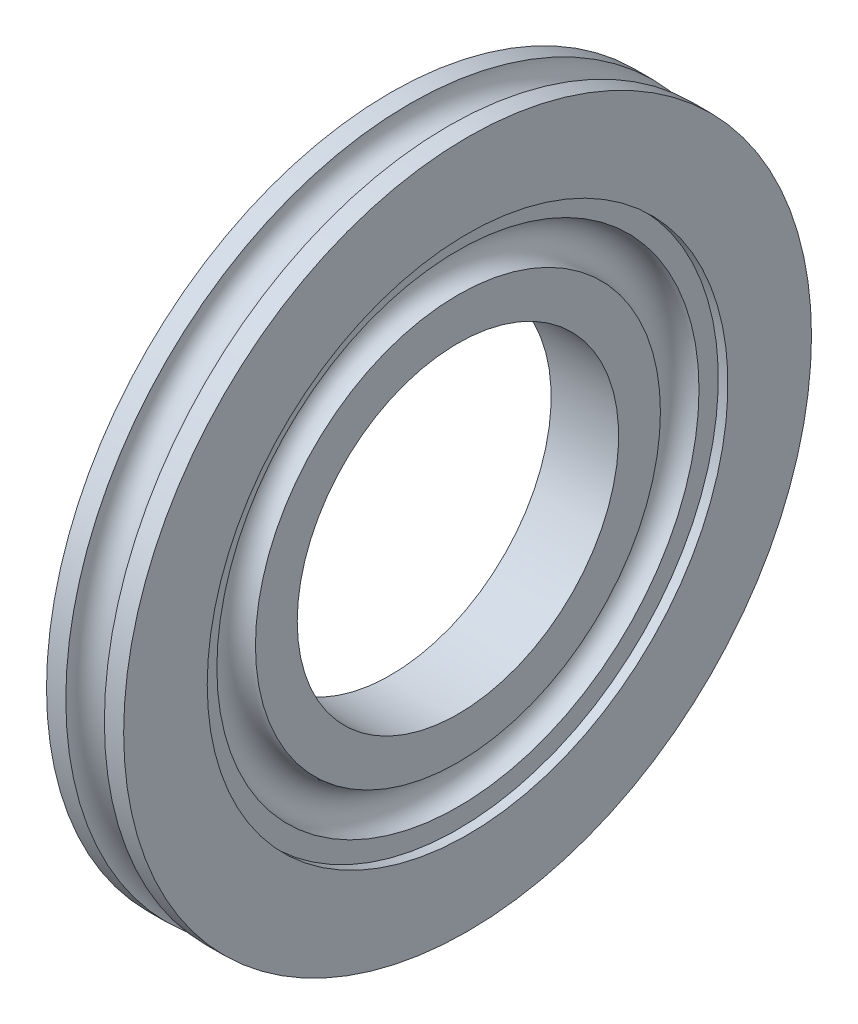
ISO-10303-21;
HEADER;
FILE_DESCRIPTION(('STEP AP214'),'2;1');
FILE_NAME('part.step','',(''),(''),'','','');
FILE_SCHEMA(('AUTOMOTIVE_DESIGN { 1 0 10303 214 1 1 1 1 }'));
ENDSEC;
DATA;
#1=APPLICATION_CONTEXT('core data for automotive mechanical design processes');
#2=APPLICATION_PROTOCOL_DEFINITION('international standard','automotive_design',2000,#1);
#3=PRODUCT_CONTEXT('',#1,'mechanical');
#4=PRODUCT('Part','Part','',(#3));
#5=PRODUCT_RELATED_PRODUCT_CATEGORY('part','',(#4));
#6=PRODUCT_DEFINITION_FORMATION('','',#4);
#7=PRODUCT_DEFINITION_CONTEXT('part definition',#1,'design');
#8=PRODUCT_DEFINITION('design','',#6,#7);
#9=PRODUCT_DEFINITION_SHAPE('','',#8);
#10=(LENGTH_UNIT() NAMED_UNIT(*) SI_UNIT(.MILLI.,.METRE.));
#11=(NAMED_UNIT(*) PLANE_ANGLE_UNIT() SI_UNIT($,.RADIAN.));
#12=(NAMED_UNIT(*) SI_UNIT($,.STERADIAN.) SOLID_ANGLE_UNIT());
#13=UNCERTAINTY_MEASURE_WITH_UNIT(LENGTH_MEASURE(1.E-05),#10,'distance_accuracy_value','');
#14=(GEOMETRIC_REPRESENTATION_CONTEXT(3) GLOBAL_UNCERTAINTY_ASSIGNED_CONTEXT((#13)) GLOBAL_UNIT_ASSIGNED_CONTEXT((#10,
#11,#12)) REPRESENTATION_CONTEXT('',''));
#15=CARTESIAN_POINT('',(0.,0.,0.));
#16=DIRECTION('',(0.,0.,1.));
#17=DIRECTION('',(1.,0.,0.));
#18=AXIS2_PLACEMENT_3D('',#15,#16,#17);
#19=CARTESIAN_POINT('',(0.,0.,0.));
#20=DIRECTION('',(-1.,0.,0.));
#21=DIRECTION('',(0.,0.,1.));
#22=AXIS2_PLACEMENT_3D('',#19,#20,#21);
#23=CYLINDRICAL_SURFACE('',#22,10.287);
#24=CARTESIAN_POINT('',(3.04799999999996,0.,0.));
#25=DIRECTION('',(-1.,0.,0.));
#26=DIRECTION('',(0.,0.,1.));
#27=AXIS2_PLACEMENT_3D('',#24,#25,#26);
#28=CIRCLE('',#27,10.287);
#29=CARTESIAN_POINT('',(3.04799999999995,0.,10.287));
#30=VERTEX_POINT('',#29);
#31=EDGE_CURVE('E17',#30,#30,#28,.F.);
#32=ORIENTED_EDGE('',*,*,#31,.T.);
#33=EDGE_LOOP('',(#32));
#34=FACE_BOUND('',#33,.T.);
#35=CARTESIAN_POINT('',(2.66699999999995,0.,0.));
#36=DIRECTION('',(-1.,0.,0.));
#37=DIRECTION('',(0.,0.,1.));
#38=AXIS2_PLACEMENT_3D('',#35,#36,#37);
#39=CIRCLE('',#38,10.287);
#40=CARTESIAN_POINT('',(2.66699999999994,0.,10.287));
#41=VERTEX_POINT('',#40);
#42=EDGE_CURVE('E43',#41,#41,#39,.T.);
#43=ORIENTED_EDGE('',*,*,#42,.T.);
#44=EDGE_LOOP('',(#43));
#45=FACE_BOUND('',#44,.T.);
#46=ADVANCED_FACE('F14',(#34,#45),#23,.F.);
#47=CARTESIAN_POINT('',(3.04799999999911,13.589,0.));
#48=DIRECTION('',(-1.,0.,0.));
#49=DIRECTION('',(0.,0.,1.));
#50=AXIS2_PLACEMENT_3D('',#47,#48,#49);
#51=PLANE('',#50);
#52=ORIENTED_EDGE('',*,*,#31,.F.);
#53=EDGE_LOOP('',(#52));
#54=FACE_BOUND('',#53,.T.);
#55=CARTESIAN_POINT('',(3.04799999999997,0.,0.));
#56=DIRECTION('',(-1.,0.,0.));
#57=DIRECTION('',(0.,0.,1.));
#58=AXIS2_PLACEMENT_3D('',#55,#56,#57);
#59=CIRCLE('',#58,13.5889999999999);
#60=CARTESIAN_POINT('',(3.04799999999995,0.,13.5889999999999));
#61=VERTEX_POINT('',#60);
#62=EDGE_CURVE('E41',#61,#61,#59,.T.);
#63=ORIENTED_EDGE('',*,*,#62,.F.);
#64=EDGE_LOOP('',(#63));
#65=FACE_BOUND('',#64,.T.);
#66=ADVANCED_FACE('F51',(#54,#65),#51,.F.);
#67=CARTESIAN_POINT('',(2.66699999999917,10.287,0.));
#68=DIRECTION('',(-1.,0.,0.));
#69=DIRECTION('',(0.,0.,1.));
#70=AXIS2_PLACEMENT_3D('',#67,#68,#69);
#71=PLANE('',#70);
#72=CARTESIAN_POINT('',(2.66699999999918,0.,0.));
#73=DIRECTION('',(-1.,0.,0.));
#74=DIRECTION('',(0.,0.,1.));
#75=AXIS2_PLACEMENT_3D('',#72,#73,#74);
#76=CIRCLE('',#75,9.525);
#77=CARTESIAN_POINT('',(2.66699999999917,0.,9.525));
#78=VERTEX_POINT('',#77);
#79=EDGE_CURVE('E38',#78,#78,#76,.T.);
#80=ORIENTED_EDGE('',*,*,#79,.T.);
#81=EDGE_LOOP('',(#80));
#82=FACE_BOUND('',#81,.T.);
#83=ORIENTED_EDGE('',*,*,#42,.F.);
#84=EDGE_LOOP('',(#83));
#85=FACE_BOUND('',#84,.T.);
#86=ADVANCED_FACE('F54',(#82,#85),#71,.F.);
#87=CARTESIAN_POINT('',(0.,0.,0.));
#88=DIRECTION('',(-1.,0.,0.));
#89=DIRECTION('',(0.,0.,1.));
#90=AXIS2_PLACEMENT_3D('',#87,#88,#89);
#91=CYLINDRICAL_SURFACE('',#90,13.5889999999999);
#92=CARTESIAN_POINT('',(2.28599999999994,0.,0.));
#93=DIRECTION('',(-1.,0.,0.));
#94=DIRECTION('',(0.,0.,1.));
#95=AXIS2_PLACEMENT_3D('',#92,#93,#94);
#96=CIRCLE('',#95,13.589);
#97=CARTESIAN_POINT('',(2.28599999999993,0.,13.589));
#98=VERTEX_POINT('',#97);
#99=EDGE_CURVE('E29',#98,#98,#96,.F.);
#100=ORIENTED_EDGE('',*,*,#99,.T.);
#101=EDGE_LOOP('',(#100));
#102=FACE_BOUND('',#101,.T.);
#103=ORIENTED_EDGE('',*,*,#62,.T.);
#104=EDGE_LOOP('',(#103));
#105=FACE_BOUND('',#104,.T.);
#106=ADVANCED_FACE('F57',(#102,#105),#91,.T.);
#107=CARTESIAN_POINT('',(2.66699999999995,0.,0.));
#108=DIRECTION('',(-1.,0.,0.));
#109=DIRECTION('',(0.,0.,1.));
#110=AXIS2_PLACEMENT_3D('',#107,#108,#109);
#111=TOROIDAL_SURFACE('',#110,8.763,0.762000000000001);
#112=ORIENTED_EDGE('',*,*,#79,.F.);
#113=EDGE_LOOP('',(#112));
#114=FACE_BOUND('',#113,.T.);
#115=CARTESIAN_POINT('',(2.66699999999923,0.,0.));
#116=DIRECTION('',(-1.,0.,0.));
#117=DIRECTION('',(0.,0.,1.));
#118=AXIS2_PLACEMENT_3D('',#115,#116,#117);
#119=CIRCLE('',#118,8.001);
#120=CARTESIAN_POINT('',(2.66699999999923,0.,8.001));
#121=VERTEX_POINT('',#120);
#122=EDGE_CURVE('E35',#121,#121,#119,.T.);
#123=ORIENTED_EDGE('',*,*,#122,.T.);
#124=EDGE_LOOP('',(#123));
#125=FACE_BOUND('',#124,.T.);
#126=ADVANCED_FACE('F59',(#114,#125),#111,.F.);
#127=CARTESIAN_POINT('',(2.66699999999923,8.00100000000009,0.));
#128=DIRECTION('',(-1.,0.,0.));
#129=DIRECTION('',(0.,0.,1.));
#130=AXIS2_PLACEMENT_3D('',#127,#128,#129);
#131=PLANE('',#130);
#132=ORIENTED_EDGE('',*,*,#122,.F.);
#133=EDGE_LOOP('',(#132));
#134=FACE_BOUND('',#133,.T.);
#135=CARTESIAN_POINT('',(2.66699999999996,0.,0.));
#136=DIRECTION('',(-1.,0.,0.));
#137=DIRECTION('',(0.,0.,1.));
#138=AXIS2_PLACEMENT_3D('',#135,#136,#137);
#139=CIRCLE('',#138,6.34999999999997);
#140=CARTESIAN_POINT('',(2.66699999999995,0.,6.34999999999997));
#141=VERTEX_POINT('',#140);
#142=EDGE_CURVE('E32',#141,#141,#139,.T.);
#143=ORIENTED_EDGE('',*,*,#142,.T.);
#144=EDGE_LOOP('',(#143));
#145=FACE_BOUND('',#144,.T.);
#146=ADVANCED_FACE('F67',(#134,#145),#131,.F.);
#147=CARTESIAN_POINT('',(1.52399999999994,0.,0.));
#148=DIRECTION('',(-1.,0.,0.));
#149=DIRECTION('',(0.,0.,1.));
#150=AXIS2_PLACEMENT_3D('',#147,#148,#149);
#151=TOROIDAL_SURFACE('',#150,13.589,0.762);
#152=ORIENTED_EDGE('',*,*,#99,.F.);
#153=EDGE_LOOP('',(#152));
#154=FACE_BOUND('',#153,.T.);
#155=CARTESIAN_POINT('',(0.761999999999975,0.,0.));
#156=DIRECTION('',(-1.,0.,0.));
#157=DIRECTION('',(0.,0.,1.));
#158=AXIS2_PLACEMENT_3D('',#155,#156,#157);
#159=CIRCLE('',#158,13.5889999999999);
#160=CARTESIAN_POINT('',(0.761999999999962,0.,13.5889999999999));
#161=VERTEX_POINT('',#160);
#162=EDGE_CURVE('E26',#161,#161,#159,.T.);
#163=ORIENTED_EDGE('',*,*,#162,.F.);
#164=EDGE_LOOP('',(#163));
#165=FACE_BOUND('',#164,.T.);
#166=ADVANCED_FACE('F87',(#154,#165),#151,.F.);
#167=CARTESIAN_POINT('',(3.04799999999994,0.,0.));
#168=DIRECTION('',(-1.,0.,0.));
#169=DIRECTION('',(0.,0.,1.));
#170=AXIS2_PLACEMENT_3D('',#167,#168,#169);
#171=CYLINDRICAL_SURFACE('',#170,6.34999999999997);
#172=ORIENTED_EDGE('',*,*,#142,.F.);
#173=EDGE_LOOP('',(#172));
#174=FACE_BOUND('',#173,.T.);
#175=CARTESIAN_POINT('',(0.,0.,0.));
#176=DIRECTION('',(-1.,0.,0.));
#177=DIRECTION('',(0.,0.,1.));
#178=AXIS2_PLACEMENT_3D('',#175,#176,#177);
#179=CIRCLE('',#178,6.34999999999997);
#180=CARTESIAN_POINT('',(0.,0.,6.34999999999997));
#181=VERTEX_POINT('',#180);
#182=EDGE_CURVE('E21',#181,#181,#179,.T.);
#183=ORIENTED_EDGE('',*,*,#182,.T.);
#184=EDGE_LOOP('',(#183));
#185=FACE_BOUND('',#184,.T.);
#186=ADVANCED_FACE('F81',(#174,#185),#171,.F.);
#187=CARTESIAN_POINT('',(0.,0.,0.));
#188=DIRECTION('',(-1.,0.,0.));
#189=DIRECTION('',(0.,0.,1.));
#190=AXIS2_PLACEMENT_3D('',#187,#188,#189);
#191=CYLINDRICAL_SURFACE('',#190,13.5889999999999);
#192=CARTESIAN_POINT('',(0.,0.,0.));
#193=DIRECTION('',(-1.,0.,0.));
#194=DIRECTION('',(0.,0.,1.));
#195=AXIS2_PLACEMENT_3D('',#192,#193,#194);
#196=CIRCLE('',#195,13.5889999999999);
#197=CARTESIAN_POINT('',(0.,0.,13.5889999999999));
#198=VERTEX_POINT('',#197);
#199=EDGE_CURVE('E10',#198,#198,#196,.F.);
#200=ORIENTED_EDGE('',*,*,#199,.T.);
#201=EDGE_LOOP('',(#200));
#202=FACE_BOUND('',#201,.T.);
#203=ORIENTED_EDGE('',*,*,#162,.T.);
#204=EDGE_LOOP('',(#203));
#205=FACE_BOUND('',#204,.T.);
#206=ADVANCED_FACE('F75',(#202,#205),#191,.T.);
#207=CARTESIAN_POINT('',(0.,0.,0.));
#208=DIRECTION('',(1.,0.,0.));
#209=DIRECTION('',(0.,0.,-1.));
#210=AXIS2_PLACEMENT_3D('',#207,#208,#209);
#211=PLANE('',#210);
#212=ORIENTED_EDGE('',*,*,#199,.F.);
#213=EDGE_LOOP('',(#212));
#214=FACE_BOUND('',#213,.T.);
#215=ORIENTED_EDGE('',*,*,#182,.F.);
#216=EDGE_LOOP('',(#215));
#217=FACE_BOUND('',#216,.T.);
#218=ADVANCED_FACE('F73',(#214,#217),#211,.F.);
#219=CLOSED_SHELL('',(#46,#66,#86,#106,#126,#146,#166,#186,#206,#218));
#220=MANIFOLD_SOLID_BREP('B1',#219);
#221=ADVANCED_BREP_SHAPE_REPRESENTATION('',(#18,#220),#14);
#222=SHAPE_DEFINITION_REPRESENTATION(#9,#221);
ENDSEC;
END-ISO-10303-21;
